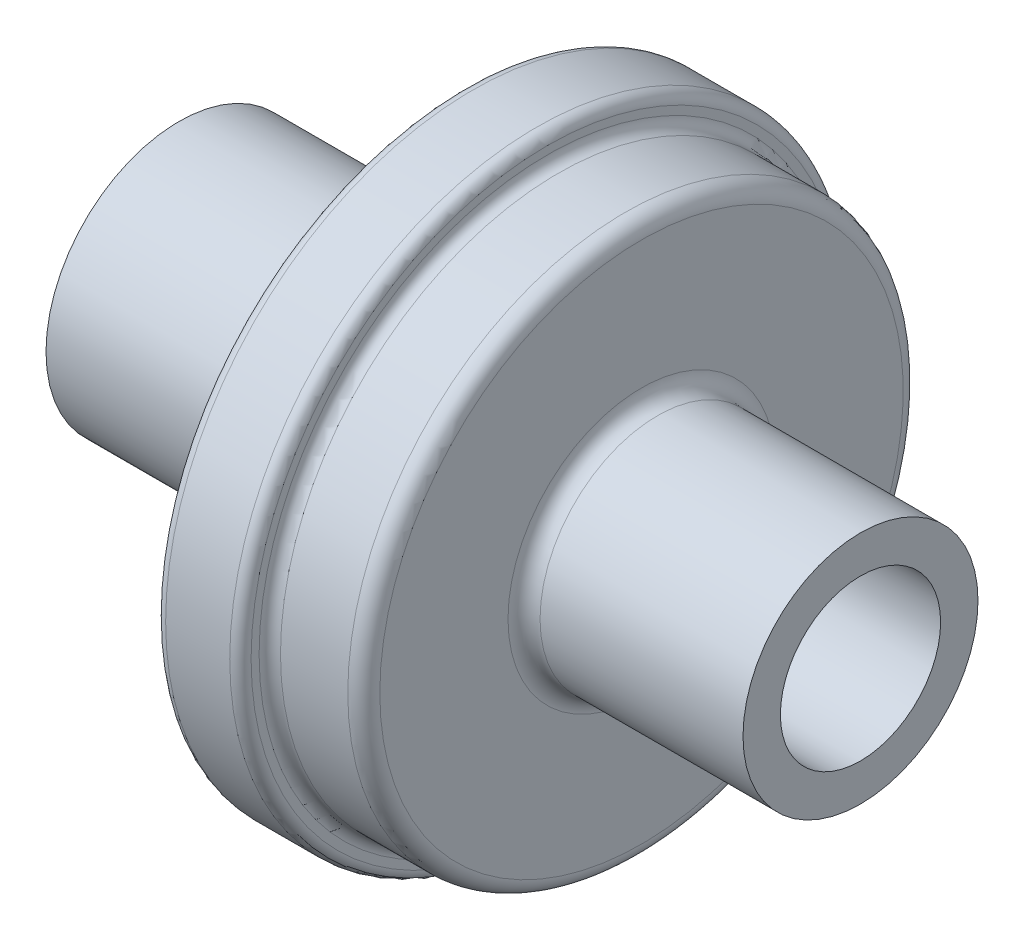
ISO-10303-21;
HEADER;
FILE_DESCRIPTION(('STEP AP214'),'2;1');
FILE_NAME('part.step','',(''),(''),'','','');
FILE_SCHEMA(('AUTOMOTIVE_DESIGN { 1 0 10303 214 1 1 1 1 }'));
ENDSEC;
DATA;
#1=APPLICATION_CONTEXT('core data for automotive mechanical design processes');
#2=APPLICATION_PROTOCOL_DEFINITION('international standard','automotive_design',2000,#1);
#3=PRODUCT_CONTEXT('',#1,'mechanical');
#4=PRODUCT('Part','Part','',(#3));
#5=PRODUCT_RELATED_PRODUCT_CATEGORY('part','',(#4));
#6=PRODUCT_DEFINITION_FORMATION('','',#4);
#7=PRODUCT_DEFINITION_CONTEXT('part definition',#1,'design');
#8=PRODUCT_DEFINITION('design','',#6,#7);
#9=PRODUCT_DEFINITION_SHAPE('','',#8);
#10=(LENGTH_UNIT() NAMED_UNIT(*) SI_UNIT(.MILLI.,.METRE.));
#11=(NAMED_UNIT(*) PLANE_ANGLE_UNIT() SI_UNIT($,.RADIAN.));
#12=(NAMED_UNIT(*) SI_UNIT($,.STERADIAN.) SOLID_ANGLE_UNIT());
#13=UNCERTAINTY_MEASURE_WITH_UNIT(LENGTH_MEASURE(1.E-05),#10,'distance_accuracy_value','');
#14=(GEOMETRIC_REPRESENTATION_CONTEXT(3) GLOBAL_UNCERTAINTY_ASSIGNED_CONTEXT((#13)) GLOBAL_UNIT_ASSIGNED_CONTEXT((#10,
#11,#12)) REPRESENTATION_CONTEXT('',''));
#15=CARTESIAN_POINT('',(0.,0.,0.));
#16=DIRECTION('',(0.,0.,1.));
#17=DIRECTION('',(1.,0.,0.));
#18=AXIS2_PLACEMENT_3D('',#15,#16,#17);
#19=CARTESIAN_POINT('',(60.5,0.,0.));
#20=DIRECTION('',(-1.,0.,0.));
#21=DIRECTION('',(0.,0.,1.));
#22=AXIS2_PLACEMENT_3D('',#19,#20,#21);
#23=CYLINDRICAL_SURFACE('',#22,8.5);
#24=CARTESIAN_POINT('',(-42.3,0.,0.));
#25=DIRECTION('',(-1.,0.,0.));
#26=DIRECTION('',(0.,0.,1.));
#27=AXIS2_PLACEMENT_3D('',#24,#25,#26);
#28=CIRCLE('',#27,8.5);
#29=CARTESIAN_POINT('',(-42.3,0.,8.5));
#30=VERTEX_POINT('',#29);
#31=EDGE_CURVE('E40',#30,#30,#28,.F.);
#32=ORIENTED_EDGE('',*,*,#31,.T.);
#33=EDGE_LOOP('',(#32));
#34=FACE_BOUND('',#33,.T.);
#35=CARTESIAN_POINT('',(-15.8,0.,0.));
#36=DIRECTION('',(1.,0.,0.));
#37=DIRECTION('',(0.,0.,-1.));
#38=AXIS2_PLACEMENT_3D('',#35,#36,#37);
#39=CIRCLE('',#38,8.5);
#40=CARTESIAN_POINT('',(-15.8,0.,-8.5));
#41=VERTEX_POINT('',#40);
#42=EDGE_CURVE('E36',#41,#41,#39,.T.);
#43=ORIENTED_EDGE('',*,*,#42,.F.);
#44=EDGE_LOOP('',(#43));
#45=FACE_BOUND('',#44,.T.);
#46=ADVANCED_FACE('F33',(#34,#45),#23,.T.);
#47=CARTESIAN_POINT('',(19.5,0.,0.));
#48=DIRECTION('',(1.,0.,0.));
#49=DIRECTION('',(0.,0.,-1.));
#50=AXIS2_PLACEMENT_3D('',#47,#48,#49);
#51=CIRCLE('',#50,8.5);
#52=CARTESIAN_POINT('',(19.5,0.,-8.5));
#53=VERTEX_POINT('',#52);
#54=EDGE_CURVE('E80',#53,#53,#51,.F.);
#55=ORIENTED_EDGE('',*,*,#54,.T.);
#56=EDGE_LOOP('',(#55));
#57=FACE_BOUND('',#56,.T.);
#58=CARTESIAN_POINT('',(-1.,0.,0.));
#59=DIRECTION('',(-1.,0.,0.));
#60=DIRECTION('',(0.,0.,1.));
#61=AXIS2_PLACEMENT_3D('',#58,#59,#60);
#62=CIRCLE('',#61,8.5);
#63=CARTESIAN_POINT('',(-1.,0.,8.5));
#64=VERTEX_POINT('',#63);
#65=EDGE_CURVE('E86',#64,#64,#62,.T.);
#66=ORIENTED_EDGE('',*,*,#65,.F.);
#67=EDGE_LOOP('',(#66));
#68=FACE_BOUND('',#67,.T.);
#69=ADVANCED_FACE('F175',(#57,#68),#23,.T.);
#70=CARTESIAN_POINT('',(20.5,0.,0.));
#71=DIRECTION('',(-1.,0.,0.));
#72=DIRECTION('',(0.,0.,1.));
#73=AXIS2_PLACEMENT_3D('',#70,#71,#72);
#74=CYLINDRICAL_SURFACE('',#73,10.);
#75=CARTESIAN_POINT('',(1.5,0.,0.));
#76=DIRECTION('',(-1.,0.,0.));
#77=DIRECTION('',(0.,0.,1.));
#78=AXIS2_PLACEMENT_3D('',#75,#76,#77);
#79=CIRCLE('',#78,10.);
#80=CARTESIAN_POINT('',(1.5,0.,10.));
#81=VERTEX_POINT('',#80);
#82=EDGE_CURVE('E83',#81,#81,#79,.F.);
#83=ORIENTED_EDGE('',*,*,#82,.F.);
#84=EDGE_LOOP('',(#83));
#85=FACE_BOUND('',#84,.T.);
#86=CARTESIAN_POINT('',(19.5,0.,0.));
#87=DIRECTION('',(1.,0.,0.));
#88=DIRECTION('',(0.,0.,-1.));
#89=AXIS2_PLACEMENT_3D('',#86,#87,#88);
#90=CIRCLE('',#89,10.);
#91=CARTESIAN_POINT('',(19.5,0.,-10.));
#92=VERTEX_POINT('',#91);
#93=EDGE_CURVE('E77',#92,#92,#90,.T.);
#94=ORIENTED_EDGE('',*,*,#93,.T.);
#95=EDGE_LOOP('',(#94));
#96=FACE_BOUND('',#95,.T.);
#97=ADVANCED_FACE('F180',(#85,#96),#74,.F.);
#98=CARTESIAN_POINT('',(19.5,0.,0.));
#99=DIRECTION('',(1.,0.,0.));
#100=DIRECTION('',(0.,0.,-1.));
#101=AXIS2_PLACEMENT_3D('',#98,#99,#100);
#102=PLANE('',#101);
#103=ORIENTED_EDGE('',*,*,#54,.F.);
#104=EDGE_LOOP('',(#103));
#105=FACE_BOUND('',#104,.T.);
#106=ORIENTED_EDGE('',*,*,#93,.F.);
#107=EDGE_LOOP('',(#106));
#108=FACE_BOUND('',#107,.T.);
#109=ADVANCED_FACE('F250',(#105,#108),#102,.F.);
#110=CARTESIAN_POINT('',(-8.8,0.,0.));
#111=DIRECTION('',(1.,0.,0.));
#112=DIRECTION('',(0.,0.,-1.));
#113=AXIS2_PLACEMENT_3D('',#110,#111,#112);
#114=CYLINDRICAL_SURFACE('',#113,25.);
#115=CARTESIAN_POINT('',(-7.8,0.,0.));
#116=DIRECTION('',(1.,0.,0.));
#117=DIRECTION('',(0.,0.,-1.));
#118=AXIS2_PLACEMENT_3D('',#115,#116,#117);
#119=CIRCLE('',#118,25.);
#120=CARTESIAN_POINT('',(-7.8,0.,-25.));
#121=VERTEX_POINT('',#120);
#122=EDGE_CURVE('E74',#121,#121,#119,.T.);
#123=ORIENTED_EDGE('',*,*,#122,.F.);
#124=EDGE_LOOP('',(#123));
#125=FACE_BOUND('',#124,.T.);
#126=CARTESIAN_POINT('',(-1.5,0.,0.));
#127=DIRECTION('',(1.,0.,0.));
#128=DIRECTION('',(0.,0.,-1.));
#129=AXIS2_PLACEMENT_3D('',#126,#127,#128);
#130=CIRCLE('',#129,25.);
#131=CARTESIAN_POINT('',(-1.5,0.,-25.));
#132=VERTEX_POINT('',#131);
#133=EDGE_CURVE('E71',#132,#132,#130,.F.);
#134=ORIENTED_EDGE('',*,*,#133,.F.);
#135=EDGE_LOOP('',(#134));
#136=FACE_BOUND('',#135,.T.);
#137=ADVANCED_FACE('F246',(#125,#136),#114,.F.);
#138=CARTESIAN_POINT('',(-1.,0.,0.));
#139=DIRECTION('',(-1.,0.,0.));
#140=DIRECTION('',(0.,0.,1.));
#141=AXIS2_PLACEMENT_3D('',#138,#139,#140);
#142=PLANE('',#141);
#143=CARTESIAN_POINT('',(-1.,0.,0.));
#144=DIRECTION('',(-1.,0.,0.));
#145=DIRECTION('',(0.,0.,1.));
#146=AXIS2_PLACEMENT_3D('',#143,#144,#145);
#147=CIRCLE('',#146,24.5);
#148=CARTESIAN_POINT('',(-1.,0.,24.5));
#149=VERTEX_POINT('',#148);
#150=EDGE_CURVE('E68',#149,#149,#147,.F.);
#151=ORIENTED_EDGE('',*,*,#150,.F.);
#152=EDGE_LOOP('',(#151));
#153=FACE_BOUND('',#152,.T.);
#154=CARTESIAN_POINT('',(-0.999999999999999,0.,0.));
#155=DIRECTION('',(-1.,0.,0.));
#156=DIRECTION('',(0.,0.,1.));
#157=AXIS2_PLACEMENT_3D('',#154,#155,#156);
#158=CIRCLE('',#157,12.5);
#159=CARTESIAN_POINT('',(-0.999999999999999,0.,12.5));
#160=VERTEX_POINT('',#159);
#161=EDGE_CURVE('E65',#160,#160,#158,.T.);
#162=ORIENTED_EDGE('',*,*,#161,.F.);
#163=EDGE_LOOP('',(#162));
#164=FACE_BOUND('',#163,.T.);
#165=ADVANCED_FACE('F242',(#153,#164),#142,.T.);
#166=CARTESIAN_POINT('',(-16.8,0.,0.));
#167=DIRECTION('',(1.,0.,0.));
#168=DIRECTION('',(0.,0.,-1.));
#169=AXIS2_PLACEMENT_3D('',#166,#167,#168);
#170=CYLINDRICAL_SURFACE('',#169,27.75);
#171=CARTESIAN_POINT('',(-9.8,0.,0.));
#172=DIRECTION('',(-1.,0.,0.));
#173=DIRECTION('',(0.,0.,1.));
#174=AXIS2_PLACEMENT_3D('',#171,#172,#173);
#175=CIRCLE('',#174,27.75);
#176=CARTESIAN_POINT('',(-9.8,0.,27.75));
#177=VERTEX_POINT('',#176);
#178=EDGE_CURVE('E62',#177,#177,#175,.T.);
#179=ORIENTED_EDGE('',*,*,#178,.F.);
#180=EDGE_LOOP('',(#179));
#181=FACE_BOUND('',#180,.T.);
#182=CARTESIAN_POINT('',(-15.8,0.,0.));
#183=DIRECTION('',(-1.,0.,0.));
#184=DIRECTION('',(0.,0.,1.));
#185=AXIS2_PLACEMENT_3D('',#182,#183,#184);
#186=CIRCLE('',#185,27.75);
#187=CARTESIAN_POINT('',(-15.8,0.,27.75));
#188=VERTEX_POINT('',#187);
#189=EDGE_CURVE('E56',#188,#188,#186,.T.);
#190=ORIENTED_EDGE('',*,*,#189,.T.);
#191=EDGE_LOOP('',(#190));
#192=FACE_BOUND('',#191,.T.);
#193=ADVANCED_FACE('F238',(#181,#192),#170,.F.);
#194=CARTESIAN_POINT('',(-15.8,0.,0.));
#195=DIRECTION('',(-1.,0.,0.));
#196=DIRECTION('',(0.,0.,1.));
#197=AXIS2_PLACEMENT_3D('',#194,#195,#196);
#198=PLANE('',#197);
#199=ORIENTED_EDGE('',*,*,#189,.F.);
#200=EDGE_LOOP('',(#199));
#201=FACE_BOUND('',#200,.T.);
#202=CARTESIAN_POINT('',(-15.8,0.,0.));
#203=DIRECTION('',(-1.,0.,0.));
#204=DIRECTION('',(0.,0.,1.));
#205=AXIS2_PLACEMENT_3D('',#202,#203,#204);
#206=CIRCLE('',#205,16.5357864376269);
#207=CARTESIAN_POINT('',(-15.8,0.,16.5357864376269));
#208=VERTEX_POINT('',#207);
#209=EDGE_CURVE('E59',#208,#208,#206,.F.);
#210=ORIENTED_EDGE('',*,*,#209,.F.);
#211=EDGE_LOOP('',(#210));
#212=FACE_BOUND('',#211,.T.);
#213=ADVANCED_FACE('F234',(#201,#212),#198,.F.);
#214=CARTESIAN_POINT('',(-9.8,0.,0.));
#215=DIRECTION('',(-1.,0.,0.));
#216=DIRECTION('',(0.,0.,1.));
#217=AXIS2_PLACEMENT_3D('',#214,#215,#216);
#218=PLANE('',#217);
#219=ORIENTED_EDGE('',*,*,#178,.T.);
#220=EDGE_LOOP('',(#219));
#221=FACE_BOUND('',#220,.T.);
#222=CARTESIAN_POINT('',(-9.8,0.,0.));
#223=DIRECTION('',(-1.,0.,0.));
#224=DIRECTION('',(0.,0.,1.));
#225=AXIS2_PLACEMENT_3D('',#222,#223,#224);
#226=CIRCLE('',#225,27.);
#227=CARTESIAN_POINT('',(-9.8,0.,27.));
#228=VERTEX_POINT('',#227);
#229=EDGE_CURVE('E53',#228,#228,#226,.T.);
#230=ORIENTED_EDGE('',*,*,#229,.F.);
#231=EDGE_LOOP('',(#230));
#232=FACE_BOUND('',#231,.T.);
#233=ADVANCED_FACE('F230',(#221,#232),#218,.T.);
#234=CARTESIAN_POINT('',(-43.3,0.,0.));
#235=DIRECTION('',(1.,0.,0.));
#236=DIRECTION('',(0.,0.,-1.));
#237=AXIS2_PLACEMENT_3D('',#234,#235,#236);
#238=CYLINDRICAL_SURFACE('',#237,11.45);
#239=CARTESIAN_POINT('',(-20.8857864376269,0.,0.));
#240=DIRECTION('',(1.,0.,0.));
#241=DIRECTION('',(0.,0.,-1.));
#242=AXIS2_PLACEMENT_3D('',#239,#240,#241);
#243=CIRCLE('',#242,11.45);
#244=CARTESIAN_POINT('',(-20.8857864376269,0.,-11.45));
#245=VERTEX_POINT('',#244);
#246=EDGE_CURVE('E45',#245,#245,#243,.F.);
#247=ORIENTED_EDGE('',*,*,#246,.F.);
#248=EDGE_LOOP('',(#247));
#249=FACE_BOUND('',#248,.T.);
#250=CARTESIAN_POINT('',(-42.3,0.,0.));
#251=DIRECTION('',(-1.,0.,0.));
#252=DIRECTION('',(0.,0.,1.));
#253=AXIS2_PLACEMENT_3D('',#250,#251,#252);
#254=CIRCLE('',#253,11.45);
#255=CARTESIAN_POINT('',(-42.3,0.,11.45));
#256=VERTEX_POINT('',#255);
#257=EDGE_CURVE('E10',#256,#256,#254,.T.);
#258=ORIENTED_EDGE('',*,*,#257,.T.);
#259=EDGE_LOOP('',(#258));
#260=FACE_BOUND('',#259,.T.);
#261=ADVANCED_FACE('F226',(#249,#260),#238,.F.);
#262=CARTESIAN_POINT('',(-42.3,0.,0.));
#263=DIRECTION('',(-1.,0.,0.));
#264=DIRECTION('',(0.,0.,1.));
#265=AXIS2_PLACEMENT_3D('',#262,#263,#264);
#266=PLANE('',#265);
#267=ORIENTED_EDGE('',*,*,#31,.F.);
#268=EDGE_LOOP('',(#267));
#269=FACE_BOUND('',#268,.T.);
#270=ORIENTED_EDGE('',*,*,#257,.F.);
#271=EDGE_LOOP('',(#270));
#272=FACE_BOUND('',#271,.T.);
#273=ADVANCED_FACE('F222',(#269,#272),#266,.F.);
#274=CARTESIAN_POINT('',(1.5,0.,0.));
#275=DIRECTION('',(-1.,0.,0.));
#276=DIRECTION('',(0.,0.,1.));
#277=AXIS2_PLACEMENT_3D('',#274,#275,#276);
#278=TOROIDAL_SURFACE('',#277,12.5,2.5);
#279=ORIENTED_EDGE('',*,*,#161,.T.);
#280=EDGE_LOOP('',(#279));
#281=FACE_BOUND('',#280,.T.);
#282=ORIENTED_EDGE('',*,*,#82,.T.);
#283=EDGE_LOOP('',(#282));
#284=FACE_BOUND('',#283,.T.);
#285=ADVANCED_FACE('F218',(#281,#284),#278,.T.);
#286=CARTESIAN_POINT('',(-1.5,0.,0.));
#287=DIRECTION('',(-1.,0.,0.));
#288=DIRECTION('',(0.,0.,1.));
#289=AXIS2_PLACEMENT_3D('',#286,#287,#288);
#290=TOROIDAL_SURFACE('',#289,24.5,0.5);
#291=ORIENTED_EDGE('',*,*,#150,.T.);
#292=EDGE_LOOP('',(#291));
#293=FACE_BOUND('',#292,.T.);
#294=ORIENTED_EDGE('',*,*,#133,.T.);
#295=EDGE_LOOP('',(#294));
#296=FACE_BOUND('',#295,.T.);
#297=ADVANCED_FACE('F211',(#293,#296),#290,.F.);
#298=CARTESIAN_POINT('',(-7.8,0.,0.));
#299=DIRECTION('',(-1.,0.,0.));
#300=DIRECTION('',(0.,0.,1.));
#301=AXIS2_PLACEMENT_3D('',#298,#299,#300);
#302=TOROIDAL_SURFACE('',#301,27.,2.);
#303=ORIENTED_EDGE('',*,*,#122,.T.);
#304=EDGE_LOOP('',(#303));
#305=FACE_BOUND('',#304,.T.);
#306=ORIENTED_EDGE('',*,*,#229,.T.);
#307=EDGE_LOOP('',(#306));
#308=FACE_BOUND('',#307,.T.);
#309=ADVANCED_FACE('F206',(#305,#308),#302,.T.);
#310=CARTESIAN_POINT('',(-20.5928932188135,0.,0.));
#311=DIRECTION('',(1.,0.,0.));
#312=DIRECTION('',(0.,0.,-1.));
#313=AXIS2_PLACEMENT_3D('',#310,#311,#312);
#314=CONICAL_SURFACE('',#313,11.7428932188134,0.785398163397442);
#315=ORIENTED_EDGE('',*,*,#209,.T.);
#316=EDGE_LOOP('',(#315));
#317=FACE_BOUND('',#316,.T.);
#318=ORIENTED_EDGE('',*,*,#246,.T.);
#319=EDGE_LOOP('',(#318));
#320=FACE_BOUND('',#319,.T.);
#321=ADVANCED_FACE('F198',(#317,#320),#314,.F.);
#322=CARTESIAN_POINT('',(-1.,0.,0.));
#323=DIRECTION('',(-1.,0.,0.));
#324=DIRECTION('',(0.,0.,1.));
#325=AXIS2_PLACEMENT_3D('',#322,#323,#324);
#326=PLANE('',#325);
#327=CARTESIAN_POINT('',(-1.,0.,0.));
#328=DIRECTION('',(-1.,0.,0.));
#329=DIRECTION('',(0.,0.,1.));
#330=AXIS2_PLACEMENT_3D('',#327,#328,#329);
#331=CIRCLE('',#330,7.5);
#332=CARTESIAN_POINT('',(-1.,0.,7.5));
#333=VERTEX_POINT('',#332);
#334=EDGE_CURVE('E88',#333,#333,#331,.T.);
#335=ORIENTED_EDGE('',*,*,#334,.F.);
#336=EDGE_LOOP('',(#335));
#337=FACE_BOUND('',#336,.T.);
#338=ORIENTED_EDGE('',*,*,#65,.T.);
#339=EDGE_LOOP('',(#338));
#340=FACE_BOUND('',#339,.T.);
#341=ADVANCED_FACE('F189',(#337,#340),#326,.T.);
#342=CARTESIAN_POINT('',(-15.8,0.,0.));
#343=DIRECTION('',(1.,0.,0.));
#344=DIRECTION('',(0.,0.,-1.));
#345=AXIS2_PLACEMENT_3D('',#342,#343,#344);
#346=PLANE('',#345);
#347=CARTESIAN_POINT('',(-15.8,0.,0.));
#348=DIRECTION('',(1.,0.,0.));
#349=DIRECTION('',(0.,0.,-1.));
#350=AXIS2_PLACEMENT_3D('',#347,#348,#349);
#351=CIRCLE('',#350,7.5);
#352=CARTESIAN_POINT('',(-15.8,0.,-7.5));
#353=VERTEX_POINT('',#352);
#354=EDGE_CURVE('E96',#353,#353,#351,.T.);
#355=ORIENTED_EDGE('',*,*,#354,.F.);
#356=EDGE_LOOP('',(#355));
#357=FACE_BOUND('',#356,.T.);
#358=ORIENTED_EDGE('',*,*,#42,.T.);
#359=EDGE_LOOP('',(#358));
#360=FACE_BOUND('',#359,.T.);
#361=ADVANCED_FACE('F186',(#357,#360),#346,.T.);
#362=CARTESIAN_POINT('',(60.5,0.,0.));
#363=DIRECTION('',(-1.,0.,0.));
#364=DIRECTION('',(0.,0.,1.));
#365=AXIS2_PLACEMENT_3D('',#362,#363,#364);
#366=CYLINDRICAL_SURFACE('',#365,7.5);
#367=CARTESIAN_POINT('',(-43.3,0.,0.));
#368=DIRECTION('',(-1.,0.,0.));
#369=DIRECTION('',(0.,0.,1.));
#370=AXIS2_PLACEMENT_3D('',#367,#368,#369);
#371=CIRCLE('',#370,7.5);
#372=CARTESIAN_POINT('',(-43.3,0.,7.5));
#373=VERTEX_POINT('',#372);
#374=EDGE_CURVE('E48',#373,#373,#371,.F.);
#375=ORIENTED_EDGE('',*,*,#374,.F.);
#376=EDGE_LOOP('',(#375));
#377=FACE_BOUND('',#376,.T.);
#378=ORIENTED_EDGE('',*,*,#354,.T.);
#379=EDGE_LOOP('',(#378));
#380=FACE_BOUND('',#379,.T.);
#381=ADVANCED_FACE('F188',(#377,#380),#366,.F.);
#382=CARTESIAN_POINT('',(20.5,0.,0.));
#383=DIRECTION('',(1.,0.,0.));
#384=DIRECTION('',(0.,0.,-1.));
#385=AXIS2_PLACEMENT_3D('',#382,#383,#384);
#386=CIRCLE('',#385,7.5);
#387=CARTESIAN_POINT('',(20.5,0.,-7.5));
#388=VERTEX_POINT('',#387);
#389=EDGE_CURVE('E100',#388,#388,#386,.F.);
#390=ORIENTED_EDGE('',*,*,#389,.F.);
#391=EDGE_LOOP('',(#390));
#392=FACE_BOUND('',#391,.T.);
#393=ORIENTED_EDGE('',*,*,#334,.T.);
#394=EDGE_LOOP('',(#393));
#395=FACE_BOUND('',#394,.T.);
#396=ADVANCED_FACE('F196',(#392,#395),#366,.F.);
#397=CARTESIAN_POINT('',(20.5,0.,0.));
#398=DIRECTION('',(-1.,0.,0.));
#399=DIRECTION('',(0.,0.,1.));
#400=AXIS2_PLACEMENT_3D('',#397,#398,#399);
#401=CYLINDRICAL_SURFACE('',#400,11.);
#402=CARTESIAN_POINT('',(1.5,0.,0.));
#403=DIRECTION('',(-1.,0.,0.));
#404=DIRECTION('',(0.,0.,1.));
#405=AXIS2_PLACEMENT_3D('',#402,#403,#404);
#406=CIRCLE('',#405,11.);
#407=CARTESIAN_POINT('',(1.5,0.,11.));
#408=VERTEX_POINT('',#407);
#409=EDGE_CURVE('E109',#408,#408,#406,.F.);
#410=ORIENTED_EDGE('',*,*,#409,.T.);
#411=EDGE_LOOP('',(#410));
#412=FACE_BOUND('',#411,.T.);
#413=CARTESIAN_POINT('',(20.5,0.,0.));
#414=DIRECTION('',(1.,0.,0.));
#415=DIRECTION('',(0.,0.,-1.));
#416=AXIS2_PLACEMENT_3D('',#413,#414,#415);
#417=CIRCLE('',#416,11.);
#418=CARTESIAN_POINT('',(20.5,0.,-11.));
#419=VERTEX_POINT('',#418);
#420=EDGE_CURVE('E106',#419,#419,#417,.T.);
#421=ORIENTED_EDGE('',*,*,#420,.F.);
#422=EDGE_LOOP('',(#421));
#423=FACE_BOUND('',#422,.T.);
#424=ADVANCED_FACE('F272',(#412,#423),#401,.T.);
#425=CARTESIAN_POINT('',(20.5,0.,0.));
#426=DIRECTION('',(1.,0.,0.));
#427=DIRECTION('',(0.,0.,-1.));
#428=AXIS2_PLACEMENT_3D('',#425,#426,#427);
#429=PLANE('',#428);
#430=ORIENTED_EDGE('',*,*,#389,.T.);
#431=EDGE_LOOP('',(#430));
#432=FACE_BOUND('',#431,.T.);
#433=ORIENTED_EDGE('',*,*,#420,.T.);
#434=EDGE_LOOP('',(#433));
#435=FACE_BOUND('',#434,.T.);
#436=ADVANCED_FACE('F275',(#432,#435),#429,.T.);
#437=CARTESIAN_POINT('',(-8.8,0.,0.));
#438=DIRECTION('',(1.,0.,0.));
#439=DIRECTION('',(0.,0.,-1.));
#440=AXIS2_PLACEMENT_3D('',#437,#438,#439);
#441=CYLINDRICAL_SURFACE('',#440,26.);
#442=CARTESIAN_POINT('',(-7.8,0.,0.));
#443=DIRECTION('',(-1.,0.,0.));
#444=DIRECTION('',(0.,0.,1.));
#445=AXIS2_PLACEMENT_3D('',#442,#443,#444);
#446=CIRCLE('',#445,26.);
#447=CARTESIAN_POINT('',(-7.8,0.,26.));
#448=VERTEX_POINT('',#447);
#449=EDGE_CURVE('E124',#448,#448,#446,.F.);
#450=ORIENTED_EDGE('',*,*,#449,.T.);
#451=EDGE_LOOP('',(#450));
#452=FACE_BOUND('',#451,.T.);
#453=CARTESIAN_POINT('',(-1.5,0.,0.));
#454=DIRECTION('',(-1.,0.,0.));
#455=DIRECTION('',(0.,0.,1.));
#456=AXIS2_PLACEMENT_3D('',#453,#454,#455);
#457=CIRCLE('',#456,26.);
#458=CARTESIAN_POINT('',(-1.5,0.,26.));
#459=VERTEX_POINT('',#458);
#460=EDGE_CURVE('E115',#459,#459,#457,.T.);
#461=ORIENTED_EDGE('',*,*,#460,.T.);
#462=EDGE_LOOP('',(#461));
#463=FACE_BOUND('',#462,.T.);
#464=ADVANCED_FACE('F279',(#452,#463),#441,.T.);
#465=CARTESIAN_POINT('',(0.,0.,0.));
#466=DIRECTION('',(-1.,0.,0.));
#467=DIRECTION('',(0.,0.,1.));
#468=AXIS2_PLACEMENT_3D('',#465,#466,#467);
#469=PLANE('',#468);
#470=CARTESIAN_POINT('',(0.,0.,0.));
#471=DIRECTION('',(-1.,0.,0.));
#472=DIRECTION('',(0.,0.,1.));
#473=AXIS2_PLACEMENT_3D('',#470,#471,#472);
#474=CIRCLE('',#473,24.5);
#475=CARTESIAN_POINT('',(0.,0.,24.5));
#476=VERTEX_POINT('',#475);
#477=EDGE_CURVE('E118',#476,#476,#474,.F.);
#478=ORIENTED_EDGE('',*,*,#477,.T.);
#479=EDGE_LOOP('',(#478));
#480=FACE_BOUND('',#479,.T.);
#481=CARTESIAN_POINT('',(0.,0.,0.));
#482=DIRECTION('',(-1.,0.,0.));
#483=DIRECTION('',(0.,0.,1.));
#484=AXIS2_PLACEMENT_3D('',#481,#482,#483);
#485=CIRCLE('',#484,12.5);
#486=CARTESIAN_POINT('',(0.,0.,12.5));
#487=VERTEX_POINT('',#486);
#488=EDGE_CURVE('E112',#487,#487,#485,.T.);
#489=ORIENTED_EDGE('',*,*,#488,.T.);
#490=EDGE_LOOP('',(#489));
#491=FACE_BOUND('',#490,.T.);
#492=ADVANCED_FACE('F283',(#480,#491),#469,.F.);
#493=CARTESIAN_POINT('',(-16.8,0.,0.));
#494=DIRECTION('',(1.,0.,0.));
#495=DIRECTION('',(0.,0.,-1.));
#496=AXIS2_PLACEMENT_3D('',#493,#494,#495);
#497=CYLINDRICAL_SURFACE('',#496,28.75);
#498=CARTESIAN_POINT('',(-9.8,0.,0.));
#499=DIRECTION('',(-1.,0.,0.));
#500=DIRECTION('',(0.,0.,1.));
#501=AXIS2_PLACEMENT_3D('',#498,#499,#500);
#502=CIRCLE('',#501,28.75);
#503=CARTESIAN_POINT('',(-9.8,0.,28.75));
#504=VERTEX_POINT('',#503);
#505=EDGE_CURVE('E130',#504,#504,#502,.T.);
#506=ORIENTED_EDGE('',*,*,#505,.T.);
#507=EDGE_LOOP('',(#506));
#508=FACE_BOUND('',#507,.T.);
#509=CARTESIAN_POINT('',(-15.8,0.,0.));
#510=DIRECTION('',(-1.,0.,0.));
#511=DIRECTION('',(0.,0.,1.));
#512=AXIS2_PLACEMENT_3D('',#509,#510,#511);
#513=CIRCLE('',#512,28.75);
#514=CARTESIAN_POINT('',(-15.8,0.,28.75));
#515=VERTEX_POINT('',#514);
#516=EDGE_CURVE('E127',#515,#515,#513,.F.);
#517=ORIENTED_EDGE('',*,*,#516,.T.);
#518=EDGE_LOOP('',(#517));
#519=FACE_BOUND('',#518,.T.);
#520=ADVANCED_FACE('F287',(#508,#519),#497,.T.);
#521=CARTESIAN_POINT('',(-16.8,0.,0.));
#522=DIRECTION('',(-1.,0.,0.));
#523=DIRECTION('',(0.,0.,1.));
#524=AXIS2_PLACEMENT_3D('',#521,#522,#523);
#525=PLANE('',#524);
#526=CARTESIAN_POINT('',(-16.8,0.,0.));
#527=DIRECTION('',(-1.,0.,0.));
#528=DIRECTION('',(0.,0.,1.));
#529=AXIS2_PLACEMENT_3D('',#526,#527,#528);
#530=CIRCLE('',#529,16.9499999999999);
#531=CARTESIAN_POINT('',(-16.8,0.,16.9499999999999));
#532=VERTEX_POINT('',#531);
#533=EDGE_CURVE('E85',#532,#532,#530,.F.);
#534=ORIENTED_EDGE('',*,*,#533,.T.);
#535=EDGE_LOOP('',(#534));
#536=FACE_BOUND('',#535,.T.);
#537=CARTESIAN_POINT('',(-16.8,0.,0.));
#538=DIRECTION('',(-1.,0.,0.));
#539=DIRECTION('',(0.,0.,1.));
#540=AXIS2_PLACEMENT_3D('',#537,#538,#539);
#541=CIRCLE('',#540,27.75);
#542=CARTESIAN_POINT('',(-16.8,0.,27.75));
#543=VERTEX_POINT('',#542);
#544=EDGE_CURVE('E136',#543,#543,#541,.T.);
#545=ORIENTED_EDGE('',*,*,#544,.T.);
#546=EDGE_LOOP('',(#545));
#547=FACE_BOUND('',#546,.T.);
#548=ADVANCED_FACE('F144',(#536,#547),#525,.T.);
#549=CARTESIAN_POINT('',(-8.8,0.,0.));
#550=DIRECTION('',(-1.,0.,0.));
#551=DIRECTION('',(0.,0.,1.));
#552=AXIS2_PLACEMENT_3D('',#549,#550,#551);
#553=PLANE('',#552);
#554=CARTESIAN_POINT('',(-8.8,0.,0.));
#555=DIRECTION('',(-1.,0.,0.));
#556=DIRECTION('',(0.,0.,1.));
#557=AXIS2_PLACEMENT_3D('',#554,#555,#556);
#558=CIRCLE('',#557,27.75);
#559=CARTESIAN_POINT('',(-8.8,0.,27.75));
#560=VERTEX_POINT('',#559);
#561=EDGE_CURVE('E133',#560,#560,#558,.F.);
#562=ORIENTED_EDGE('',*,*,#561,.T.);
#563=EDGE_LOOP('',(#562));
#564=FACE_BOUND('',#563,.T.);
#565=CARTESIAN_POINT('',(-8.8,0.,0.));
#566=DIRECTION('',(-1.,0.,0.));
#567=DIRECTION('',(0.,0.,1.));
#568=AXIS2_PLACEMENT_3D('',#565,#566,#567);
#569=CIRCLE('',#568,27.);
#570=CARTESIAN_POINT('',(-8.8,0.,27.));
#571=VERTEX_POINT('',#570);
#572=EDGE_CURVE('E121',#571,#571,#569,.T.);
#573=ORIENTED_EDGE('',*,*,#572,.T.);
#574=EDGE_LOOP('',(#573));
#575=FACE_BOUND('',#574,.T.);
#576=ADVANCED_FACE('F158',(#564,#575),#553,.F.);
#577=CARTESIAN_POINT('',(-43.3,0.,0.));
#578=DIRECTION('',(1.,0.,0.));
#579=DIRECTION('',(0.,0.,-1.));
#580=AXIS2_PLACEMENT_3D('',#577,#578,#579);
#581=CYLINDRICAL_SURFACE('',#580,12.45);
#582=CARTESIAN_POINT('',(-21.3,0.,0.));
#583=DIRECTION('',(-1.,0.,0.));
#584=DIRECTION('',(0.,0.,1.));
#585=AXIS2_PLACEMENT_3D('',#582,#583,#584);
#586=CIRCLE('',#585,12.45);
#587=CARTESIAN_POINT('',(-21.3,0.,12.45));
#588=VERTEX_POINT('',#587);
#589=EDGE_CURVE('E139',#588,#588,#586,.T.);
#590=ORIENTED_EDGE('',*,*,#589,.T.);
#591=EDGE_LOOP('',(#590));
#592=FACE_BOUND('',#591,.T.);
#593=CARTESIAN_POINT('',(-43.3,0.,0.));
#594=DIRECTION('',(-1.,0.,0.));
#595=DIRECTION('',(0.,0.,1.));
#596=AXIS2_PLACEMENT_3D('',#593,#594,#595);
#597=CIRCLE('',#596,12.45);
#598=CARTESIAN_POINT('',(-43.3,0.,12.45));
#599=VERTEX_POINT('',#598);
#600=EDGE_CURVE('E103',#599,#599,#597,.T.);
#601=ORIENTED_EDGE('',*,*,#600,.F.);
#602=EDGE_LOOP('',(#601));
#603=FACE_BOUND('',#602,.T.);
#604=ADVANCED_FACE('F154',(#592,#603),#581,.T.);
#605=CARTESIAN_POINT('',(-43.3,0.,0.));
#606=DIRECTION('',(-1.,0.,0.));
#607=DIRECTION('',(0.,0.,1.));
#608=AXIS2_PLACEMENT_3D('',#605,#606,#607);
#609=PLANE('',#608);
#610=ORIENTED_EDGE('',*,*,#374,.T.);
#611=EDGE_LOOP('',(#610));
#612=FACE_BOUND('',#611,.T.);
#613=ORIENTED_EDGE('',*,*,#600,.T.);
#614=EDGE_LOOP('',(#613));
#615=FACE_BOUND('',#614,.T.);
#616=ADVANCED_FACE('F157',(#612,#615),#609,.T.);
#617=CARTESIAN_POINT('',(1.5,0.,0.));
#618=DIRECTION('',(-1.,0.,0.));
#619=DIRECTION('',(0.,0.,1.));
#620=AXIS2_PLACEMENT_3D('',#617,#618,#619);
#621=TOROIDAL_SURFACE('',#620,12.5,1.5);
#622=ORIENTED_EDGE('',*,*,#488,.F.);
#623=EDGE_LOOP('',(#622));
#624=FACE_BOUND('',#623,.T.);
#625=ORIENTED_EDGE('',*,*,#409,.F.);
#626=EDGE_LOOP('',(#625));
#627=FACE_BOUND('',#626,.T.);
#628=ADVANCED_FACE('F163',(#624,#627),#621,.F.);
#629=CARTESIAN_POINT('',(-1.5,0.,0.));
#630=DIRECTION('',(-1.,0.,0.));
#631=DIRECTION('',(0.,0.,1.));
#632=AXIS2_PLACEMENT_3D('',#629,#630,#631);
#633=TOROIDAL_SURFACE('',#632,24.5,1.5);
#634=ORIENTED_EDGE('',*,*,#477,.F.);
#635=EDGE_LOOP('',(#634));
#636=FACE_BOUND('',#635,.T.);
#637=ORIENTED_EDGE('',*,*,#460,.F.);
#638=EDGE_LOOP('',(#637));
#639=FACE_BOUND('',#638,.T.);
#640=ADVANCED_FACE('F169',(#636,#639),#633,.T.);
#641=CARTESIAN_POINT('',(-7.8,0.,0.));
#642=DIRECTION('',(-1.,0.,0.));
#643=DIRECTION('',(0.,0.,1.));
#644=AXIS2_PLACEMENT_3D('',#641,#642,#643);
#645=TOROIDAL_SURFACE('',#644,27.,1.);
#646=ORIENTED_EDGE('',*,*,#449,.F.);
#647=EDGE_LOOP('',(#646));
#648=FACE_BOUND('',#647,.T.);
#649=ORIENTED_EDGE('',*,*,#572,.F.);
#650=EDGE_LOOP('',(#649));
#651=FACE_BOUND('',#650,.T.);
#652=ADVANCED_FACE('F264',(#648,#651),#645,.F.);
#653=CARTESIAN_POINT('',(-9.8,0.,0.));
#654=DIRECTION('',(-1.,0.,0.));
#655=DIRECTION('',(0.,0.,1.));
#656=AXIS2_PLACEMENT_3D('',#653,#654,#655);
#657=TOROIDAL_SURFACE('',#656,27.75,1.);
#658=ORIENTED_EDGE('',*,*,#561,.F.);
#659=EDGE_LOOP('',(#658));
#660=FACE_BOUND('',#659,.T.);
#661=ORIENTED_EDGE('',*,*,#505,.F.);
#662=EDGE_LOOP('',(#661));
#663=FACE_BOUND('',#662,.T.);
#664=ADVANCED_FACE('F260',(#660,#663),#657,.T.);
#665=CARTESIAN_POINT('',(-15.8,0.,0.));
#666=DIRECTION('',(-1.,0.,0.));
#667=DIRECTION('',(0.,0.,1.));
#668=AXIS2_PLACEMENT_3D('',#665,#666,#667);
#669=TOROIDAL_SURFACE('',#668,27.75,1.);
#670=ORIENTED_EDGE('',*,*,#516,.F.);
#671=EDGE_LOOP('',(#670));
#672=FACE_BOUND('',#671,.T.);
#673=ORIENTED_EDGE('',*,*,#544,.F.);
#674=EDGE_LOOP('',(#673));
#675=FACE_BOUND('',#674,.T.);
#676=ADVANCED_FACE('F150',(#672,#675),#669,.T.);
#677=CARTESIAN_POINT('',(-21.3,0.,0.));
#678=DIRECTION('',(1.,0.,0.));
#679=DIRECTION('',(0.,0.,-1.));
#680=AXIS2_PLACEMENT_3D('',#677,#678,#679);
#681=CONICAL_SURFACE('',#680,12.45,0.785398163397442);
#682=ORIENTED_EDGE('',*,*,#533,.F.);
#683=EDGE_LOOP('',(#682));
#684=FACE_BOUND('',#683,.T.);
#685=ORIENTED_EDGE('',*,*,#589,.F.);
#686=EDGE_LOOP('',(#685));
#687=FACE_BOUND('',#686,.T.);
#688=ADVANCED_FACE('F147',(#684,#687),#681,.T.);
#689=CLOSED_SHELL('',(#46,#69,#97,#109,#137,#165,#193,#213,#233,#261,#273,#285,#297,#309,#321,
#341,#361,#381,#396,#424,#436,#464,#492,#520,#548,#576,#604,#616,#628,#640,#652,#664,#676,#688));
#690=MANIFOLD_SOLID_BREP('B2',#689);
#691=ADVANCED_BREP_SHAPE_REPRESENTATION('',(#18,#690),#14);
#692=SHAPE_DEFINITION_REPRESENTATION(#9,#691);
ENDSEC;
END-ISO-10303-21;
